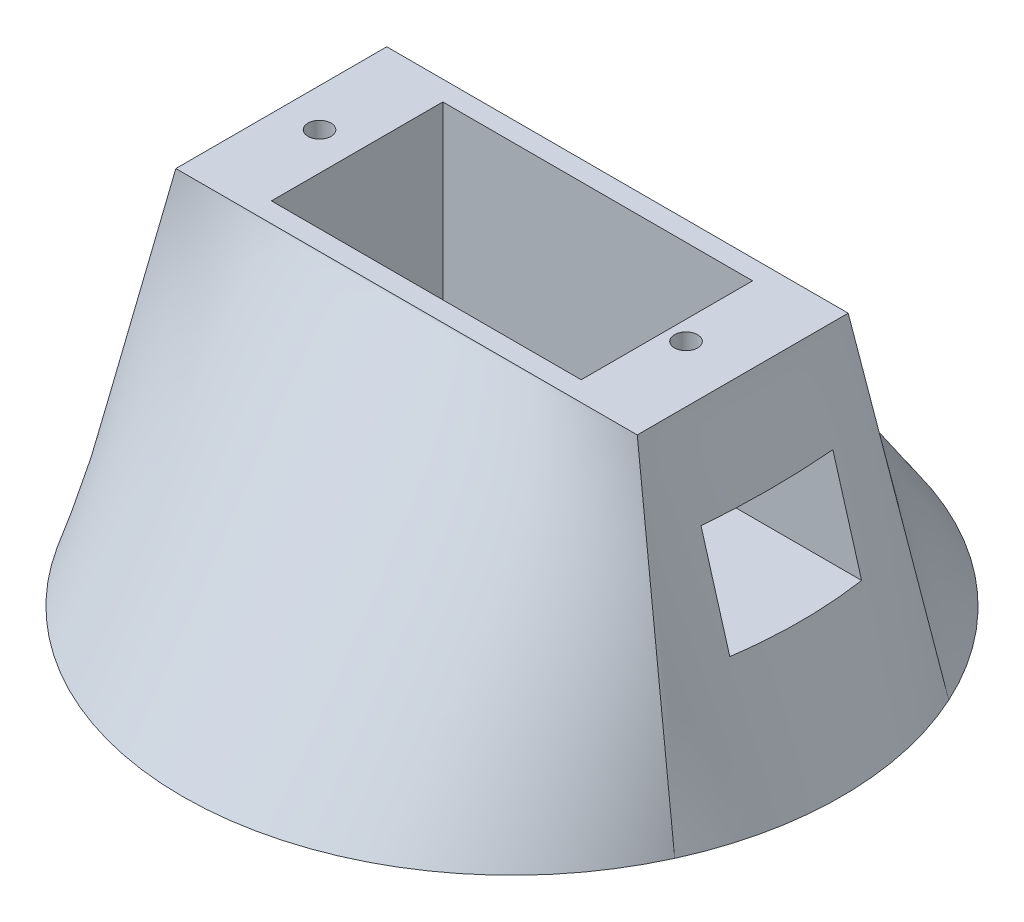
ISO-10303-21;
HEADER;
FILE_DESCRIPTION(('STEP AP214'),'2;1');
FILE_NAME('part.step','',(''),(''),'','','');
FILE_SCHEMA(('AUTOMOTIVE_DESIGN { 1 0 10303 214 1 1 1 1 }'));
ENDSEC;
DATA;
#1=APPLICATION_CONTEXT('core data for automotive mechanical design processes');
#2=APPLICATION_PROTOCOL_DEFINITION('international standard','automotive_design',2000,#1);
#3=PRODUCT_CONTEXT('',#1,'mechanical');
#4=PRODUCT('Part','Part','',(#3));
#5=PRODUCT_RELATED_PRODUCT_CATEGORY('part','',(#4));
#6=PRODUCT_DEFINITION_FORMATION('','',#4);
#7=PRODUCT_DEFINITION_CONTEXT('part definition',#1,'design');
#8=PRODUCT_DEFINITION('design','',#6,#7);
#9=PRODUCT_DEFINITION_SHAPE('','',#8);
#10=(LENGTH_UNIT() NAMED_UNIT(*) SI_UNIT(.MILLI.,.METRE.));
#11=(NAMED_UNIT(*) PLANE_ANGLE_UNIT() SI_UNIT($,.RADIAN.));
#12=(NAMED_UNIT(*) SI_UNIT($,.STERADIAN.) SOLID_ANGLE_UNIT());
#13=UNCERTAINTY_MEASURE_WITH_UNIT(LENGTH_MEASURE(1.E-05),#10,'distance_accuracy_value','');
#14=(GEOMETRIC_REPRESENTATION_CONTEXT(3) GLOBAL_UNCERTAINTY_ASSIGNED_CONTEXT((#13)) GLOBAL_UNIT_ASSIGNED_CONTEXT((#10,
#11,#12)) REPRESENTATION_CONTEXT('',''));
#15=CARTESIAN_POINT('',(0.,0.,0.));
#16=DIRECTION('',(0.,0.,1.));
#17=DIRECTION('',(1.,0.,0.));
#18=AXIS2_PLACEMENT_3D('',#15,#16,#17);
#19=CARTESIAN_POINT('',(0.,24.,0.));
#20=DIRECTION('',(0.,-1.,0.));
#21=DIRECTION('',(0.,0.,-1.));
#22=AXIS2_PLACEMENT_3D('',#19,#20,#21);
#23=PLANE('',#22);
#24=CARTESIAN_POINT('',(13.2,24.,0.));
#25=DIRECTION('',(0.,1.,0.));
#26=DIRECTION('',(0.,0.,1.));
#27=AXIS2_PLACEMENT_3D('',#24,#25,#26);
#28=CIRCLE('',#27,0.875);
#29=CARTESIAN_POINT('',(13.2,24.,0.875));
#30=VERTEX_POINT('',#29);
#31=EDGE_CURVE('E479',#30,#30,#28,.T.);
#32=ORIENTED_EDGE('',*,*,#31,.F.);
#33=EDGE_LOOP('',(#32));
#34=FACE_BOUND('',#33,.T.);
#35=CARTESIAN_POINT('',(-14.6,24.,0.));
#36=DIRECTION('',(0.,1.,0.));
#37=DIRECTION('',(0.,0.,1.));
#38=AXIS2_PLACEMENT_3D('',#35,#36,#37);
#39=CIRCLE('',#38,0.875);
#40=CARTESIAN_POINT('',(-14.6,24.,0.875));
#41=VERTEX_POINT('',#40);
#42=EDGE_CURVE('E490',#41,#41,#39,.T.);
#43=ORIENTED_EDGE('',*,*,#42,.F.);
#44=EDGE_LOOP('',(#43));
#45=FACE_BOUND('',#44,.T.);
#46=CARTESIAN_POINT('',(17.5,24.,-8.));
#47=CARTESIAN_POINT('',(17.5,24.,-6.66666666666667));
#48=CARTESIAN_POINT('',(17.5,24.,-5.33333333333334));
#49=CARTESIAN_POINT('',(17.5,24.,-2.66666666666667));
#50=CARTESIAN_POINT('',(17.5,24.,-1.33333333333334));
#51=CARTESIAN_POINT('',(17.5,24.,1.33333333333333));
#52=CARTESIAN_POINT('',(17.5,24.,2.66666666666666));
#53=CARTESIAN_POINT('',(17.5,24.,5.33333333333333));
#54=CARTESIAN_POINT('',(17.5,24.,6.66666666666667));
#55=CARTESIAN_POINT('',(17.5,24.,8.));
#56=B_SPLINE_CURVE_WITH_KNOTS('',3,(#46,#47,#48,#49,#50,#51,#52,#53,#54,#55),.UNSPECIFIED.,.F.,
.F.,(4,2,2,2,4),(0.,0.25,0.5,0.75,1.),.UNSPECIFIED.);
#57=CARTESIAN_POINT('',(17.5,24.,8.));
#58=VERTEX_POINT('',#57);
#59=CARTESIAN_POINT('',(17.5,24.,-8.));
#60=VERTEX_POINT('',#59);
#61=EDGE_CURVE('E345',#58,#60,#56,.F.);
#62=ORIENTED_EDGE('',*,*,#61,.T.);
#63=CARTESIAN_POINT('',(-17.5,24.,-8.));
#64=CARTESIAN_POINT('',(-16.7708333333333,24.,-8.));
#65=CARTESIAN_POINT('',(-16.0416666666667,24.,-8.));
#66=CARTESIAN_POINT('',(-14.5833333333333,24.,-8.));
#67=CARTESIAN_POINT('',(-13.8541666666667,24.,-8.));
#68=CARTESIAN_POINT('',(-12.3958333333333,24.,-8.));
#69=CARTESIAN_POINT('',(-11.6666666666667,24.,-8.));
#70=CARTESIAN_POINT('',(-10.2083333333333,24.,-8.));
#71=CARTESIAN_POINT('',(-9.47916666666667,24.,-8.));
#72=CARTESIAN_POINT('',(-8.02083333333333,24.,-8.));
#73=CARTESIAN_POINT('',(-7.29166666666667,24.,-8.));
#74=CARTESIAN_POINT('',(-5.83333333333333,24.,-8.));
#75=CARTESIAN_POINT('',(-5.10416666666667,24.,-8.));
#76=CARTESIAN_POINT('',(-3.64583333333333,24.,-8.));
#77=CARTESIAN_POINT('',(-2.91666666666666,24.,-8.));
#78=CARTESIAN_POINT('',(-1.45833333333333,24.,-8.));
#79=CARTESIAN_POINT('',(-0.729166666666663,24.,-8.));
#80=CARTESIAN_POINT('',(0.72916666666667,24.,-8.));
#81=CARTESIAN_POINT('',(1.45833333333334,24.,-8.));
#82=CARTESIAN_POINT('',(2.91666666666667,24.,-8.));
#83=CARTESIAN_POINT('',(3.64583333333334,24.,-8.));
#84=CARTESIAN_POINT('',(5.10416666666667,24.,-8.));
#85=CARTESIAN_POINT('',(5.83333333333334,24.,-8.));
#86=CARTESIAN_POINT('',(7.29166666666667,24.,-8.));
#87=CARTESIAN_POINT('',(8.02083333333333,24.,-8.));
#88=CARTESIAN_POINT('',(9.47916666666667,24.,-8.));
#89=CARTESIAN_POINT('',(10.2083333333333,24.,-8.));
#90=CARTESIAN_POINT('',(11.6666666666667,24.,-8.));
#91=CARTESIAN_POINT('',(12.3958333333333,24.,-8.));
#92=CARTESIAN_POINT('',(13.8541666666667,24.,-8.));
#93=CARTESIAN_POINT('',(14.5833333333333,24.,-8.));
#94=CARTESIAN_POINT('',(16.0416666666667,24.,-8.));
#95=CARTESIAN_POINT('',(16.7708333333333,24.,-8.));
#96=CARTESIAN_POINT('',(17.5,24.,-8.));
#97=B_SPLINE_CURVE_WITH_KNOTS('',3,(#63,#64,#65,#66,#67,#68,#69,#70,#71,#72,#73,#74,#75,#76,#77,
#78,#79,#80,#81,#82,#83,#84,#85,#86,#87,#88,#89,#90,#91,#92,#93,#94,#95,#96),.UNSPECIFIED.,.F.,
.F.,(4,2,2,2,2,2,2,2,2,2,2,2,2,2,2,2,4),(0.,0.0625,0.125,0.1875,0.25,0.3125,0.375,0.4375,0.5,
0.5625,0.625,0.6875,0.75,0.8125,0.875,0.9375,1.),.UNSPECIFIED.);
#98=CARTESIAN_POINT('',(-17.5,24.,-8.));
#99=VERTEX_POINT('',#98);
#100=EDGE_CURVE('E281',#60,#99,#97,.F.);
#101=ORIENTED_EDGE('',*,*,#100,.T.);
#102=CARTESIAN_POINT('',(-17.5,24.,8.));
#103=CARTESIAN_POINT('',(-17.5,24.,6.66666666666667));
#104=CARTESIAN_POINT('',(-17.5,24.,5.33333333333334));
#105=CARTESIAN_POINT('',(-17.5,24.,2.66666666666667));
#106=CARTESIAN_POINT('',(-17.5,24.,1.33333333333334));
#107=CARTESIAN_POINT('',(-17.5,24.,-1.33333333333333));
#108=CARTESIAN_POINT('',(-17.5,24.,-2.66666666666667));
#109=CARTESIAN_POINT('',(-17.5,24.,-5.33333333333333));
#110=CARTESIAN_POINT('',(-17.5,24.,-6.66666666666667));
#111=CARTESIAN_POINT('',(-17.5,24.,-8.));
#112=B_SPLINE_CURVE_WITH_KNOTS('',3,(#102,#103,#104,#105,#106,#107,#108,#109,#110,#111),
.UNSPECIFIED.,.F.,.F.,(4,2,2,2,4),(0.,0.25,0.5,0.75,1.),.UNSPECIFIED.);
#113=CARTESIAN_POINT('',(-17.5,24.,8.));
#114=VERTEX_POINT('',#113);
#115=EDGE_CURVE('E76',#99,#114,#112,.F.);
#116=ORIENTED_EDGE('',*,*,#115,.T.);
#117=CARTESIAN_POINT('',(17.5,24.,8.));
#118=CARTESIAN_POINT('',(16.7708333333333,24.,8.));
#119=CARTESIAN_POINT('',(16.0416666666667,24.,8.));
#120=CARTESIAN_POINT('',(14.5833333333333,24.,8.));
#121=CARTESIAN_POINT('',(13.8541666666666,24.,8.));
#122=CARTESIAN_POINT('',(12.3958333333333,24.,8.));
#123=CARTESIAN_POINT('',(11.6666666666666,24.,8.));
#124=CARTESIAN_POINT('',(10.2083333333333,24.,8.));
#125=CARTESIAN_POINT('',(9.47916666666661,24.,8.));
#126=CARTESIAN_POINT('',(8.02083333333327,24.,8.));
#127=CARTESIAN_POINT('',(7.2916666666666,24.,8.));
#128=CARTESIAN_POINT('',(5.83333333333326,24.,8.));
#129=CARTESIAN_POINT('',(5.10416666666659,24.,8.));
#130=CARTESIAN_POINT('',(3.64583333333326,24.,8.));
#131=CARTESIAN_POINT('',(2.91666666666659,24.,8.));
#132=CARTESIAN_POINT('',(1.45833333333326,24.,8.));
#133=CARTESIAN_POINT('',(0.729166666666591,24.,8.));
#134=CARTESIAN_POINT('',(-0.729166666666744,24.,8.));
#135=CARTESIAN_POINT('',(-1.45833333333341,24.,8.));
#136=CARTESIAN_POINT('',(-2.91666666666675,24.,8.));
#137=CARTESIAN_POINT('',(-3.64583333333341,24.,8.));
#138=CARTESIAN_POINT('',(-5.10416666666674,24.,8.));
#139=CARTESIAN_POINT('',(-5.83333333333341,24.,8.));
#140=CARTESIAN_POINT('',(-7.29166666666674,24.,8.));
#141=CARTESIAN_POINT('',(-8.0208333333334,24.,8.));
#142=CARTESIAN_POINT('',(-9.47916666666673,24.,8.));
#143=CARTESIAN_POINT('',(-10.2083333333334,24.,8.));
#144=CARTESIAN_POINT('',(-11.6666666666667,24.,8.));
#145=CARTESIAN_POINT('',(-12.3958333333334,24.,8.));
#146=CARTESIAN_POINT('',(-13.8541666666667,24.,8.));
#147=CARTESIAN_POINT('',(-14.5833333333334,24.,8.));
#148=CARTESIAN_POINT('',(-16.0416666666667,24.,8.));
#149=CARTESIAN_POINT('',(-16.7708333333333,24.,8.));
#150=CARTESIAN_POINT('',(-17.5,24.,8.));
#151=B_SPLINE_CURVE_WITH_KNOTS('',3,(#117,#118,#119,#120,#121,#122,#123,#124,#125,#126,#127,
#128,#129,#130,#131,#132,#133,#134,#135,#136,#137,#138,#139,#140,#141,#142,#143,#144,#145,#146,
#147,#148,#149,#150),.UNSPECIFIED.,.F.,.F.,(4,2,2,2,2,2,2,2,2,2,2,2,2,2,2,2,4),(0.,
0.0625000000000001,0.125,0.1875,0.25,0.3125,0.375,0.4375,0.5,0.5625,0.625,0.6875,0.75,0.8125,
0.875,0.9375,1.),.UNSPECIFIED.);
#152=EDGE_CURVE('E12',#114,#58,#151,.F.);
#153=ORIENTED_EDGE('',*,*,#152,.T.);
#154=EDGE_LOOP('',(#62,#101,#116,#153));
#155=FACE_BOUND('',#154,.T.);
#156=DIRECTION('',(0.,0.,1.));
#157=VECTOR('',#156,1.);
#158=CARTESIAN_POINT('',(11.75,24.,-6.5));
#159=LINE('',#158,#157);
#160=CARTESIAN_POINT('',(11.75,24.,-6.5));
#161=VERTEX_POINT('',#160);
#162=CARTESIAN_POINT('',(11.75,24.,6.5));
#163=VERTEX_POINT('',#162);
#164=EDGE_CURVE('E476',#161,#163,#159,.T.);
#165=ORIENTED_EDGE('',*,*,#164,.T.);
#166=DIRECTION('',(-1.,0.,0.));
#167=VECTOR('',#166,1.);
#168=CARTESIAN_POINT('',(-11.75,24.,6.5));
#169=LINE('',#168,#167);
#170=CARTESIAN_POINT('',(-11.75,24.,6.5));
#171=VERTEX_POINT('',#170);
#172=EDGE_CURVE('E473',#163,#171,#169,.T.);
#173=ORIENTED_EDGE('',*,*,#172,.T.);
#174=DIRECTION('',(0.,0.,-1.));
#175=VECTOR('',#174,1.);
#176=CARTESIAN_POINT('',(-11.75,24.,-6.5));
#177=LINE('',#176,#175);
#178=CARTESIAN_POINT('',(-11.75,24.,-6.5));
#179=VERTEX_POINT('',#178);
#180=EDGE_CURVE('E470',#171,#179,#177,.T.);
#181=ORIENTED_EDGE('',*,*,#180,.T.);
#182=DIRECTION('',(1.,0.,0.));
#183=VECTOR('',#182,1.);
#184=CARTESIAN_POINT('',(-11.75,24.,-6.5));
#185=LINE('',#184,#183);
#186=EDGE_CURVE('E466',#179,#161,#185,.T.);
#187=ORIENTED_EDGE('',*,*,#186,.T.);
#188=EDGE_LOOP('',(#165,#173,#181,#187));
#189=FACE_BOUND('',#188,.T.);
#190=ADVANCED_FACE('F66',(#34,#45,#155,#189),#23,.F.);
#191=CARTESIAN_POINT('',(0.,0.,0.));
#192=DIRECTION('',(0.,-1.,0.));
#193=DIRECTION('',(0.,0.,-1.));
#194=AXIS2_PLACEMENT_3D('',#191,#192,#193);
#195=PLANE('',#194);
#196=CARTESIAN_POINT('',(0.,0.,0.));
#197=DIRECTION('',(0.,-1.,0.));
#198=DIRECTION('',(0.,0.,-1.));
#199=AXIS2_PLACEMENT_3D('',#196,#197,#198);
#200=CIRCLE('',#199,25.);
#201=CARTESIAN_POINT('',(22.736861889645,0.,10.3939940066949));
#202=VERTEX_POINT('',#201);
#203=CARTESIAN_POINT('',(-22.736861889645,0.,10.3939940066949));
#204=VERTEX_POINT('',#203);
#205=EDGE_CURVE('E293',#202,#204,#200,.T.);
#206=ORIENTED_EDGE('',*,*,#205,.T.);
#207=CARTESIAN_POINT('',(-22.736861889645,0.,-10.3939940066949));
#208=VERTEX_POINT('',#207);
#209=EDGE_CURVE('E304',#204,#208,#200,.T.);
#210=ORIENTED_EDGE('',*,*,#209,.T.);
#211=CARTESIAN_POINT('',(22.736861889645,0.,-10.3939940066949));
#212=VERTEX_POINT('',#211);
#213=EDGE_CURVE('E315',#208,#212,#200,.T.);
#214=ORIENTED_EDGE('',*,*,#213,.T.);
#215=EDGE_CURVE('E325',#212,#202,#200,.T.);
#216=ORIENTED_EDGE('',*,*,#215,.T.);
#217=EDGE_LOOP('',(#206,#210,#214,#216));
#218=FACE_BOUND('',#217,.T.);
#219=ADVANCED_FACE('F68',(#218),#195,.T.);
#220=CARTESIAN_POINT('',(-17.5,24.,8.));
#221=CARTESIAN_POINT('',(-22.736861889645,0.,10.3939940066949));
#222=CARTESIAN_POINT('',(-17.5,24.,6.66666666666667));
#223=CARTESIAN_POINT('',(-23.4570959657197,0.,8.81848196528141));
#224=CARTESIAN_POINT('',(-17.5,24.,5.33333333333334));
#225=CARTESIAN_POINT('',(-24.0284630994066,0.,7.13081695349083));
#226=CARTESIAN_POINT('',(-17.5,24.,2.66666666666667));
#227=CARTESIAN_POINT('',(-24.8002045419033,0.,3.62842169868624));
#228=CARTESIAN_POINT('',(-17.5,24.,1.33333333333334));
#229=CARTESIAN_POINT('',(-25.,0.,1.81445979676444));
#230=CARTESIAN_POINT('',(-17.5,24.,-1.33333333333333));
#231=CARTESIAN_POINT('',(-25.,0.,-1.81445979676443));
#232=CARTESIAN_POINT('',(-17.5,24.,-2.66666666666667));
#233=CARTESIAN_POINT('',(-24.8002045419033,0.,-3.62842169868623));
#234=CARTESIAN_POINT('',(-17.5,24.,-5.33333333333333));
#235=CARTESIAN_POINT('',(-24.0284630994066,0.,-7.13081695349082));
#236=CARTESIAN_POINT('',(-17.5,24.,-6.66666666666667));
#237=CARTESIAN_POINT('',(-23.4570959657197,0.,-8.8184819652814));
#238=CARTESIAN_POINT('',(-17.5,24.,-8.));
#239=CARTESIAN_POINT('',(-22.736861889645,0.,-10.3939940066949));
#240=B_SPLINE_SURFACE_WITH_KNOTS('',3,1,((#220,#221),(#222,#223),(#224,#225),(#226,#227),(#228,
#229),(#230,#231),(#232,#233),(#234,#235),(#236,#237),(#238,#239)),.UNSPECIFIED.,.F.,.F.,.F.,(4,
2,2,2,4),(2,2),(0.,0.25,0.5,0.75,1.),(0.,1.),.UNSPECIFIED.);
#241=DIRECTION('',(-0.212181190810597,-0.972404597784712,-0.09699711579913));
#242=VECTOR('',#241,1.);
#243=CARTESIAN_POINT('',(-20.1184309448225,12.,-9.19699700334743));
#244=LINE('',#243,#242);
#245=EDGE_CURVE('E354',#99,#208,#244,.T.);
#246=DIRECTION('',(0.212181190810597,0.972404597784712,-0.0969971157991304));
#247=VECTOR('',#246,1.);
#248=CARTESIAN_POINT('',(-20.1184309448225,12.,9.19699700334743));
#249=LINE('',#248,#247);
#250=EDGE_CURVE('E356',#204,#114,#249,.T.);
#251=ORIENTED_EDGE('',*,*,#115,.F.);
#252=ORIENTED_EDGE('',*,*,#245,.T.);
#253=ORIENTED_EDGE('',*,*,#209,.F.);
#254=ORIENTED_EDGE('',*,*,#250,.T.);
#255=EDGE_LOOP('',(#251,#252,#253,#254));
#256=FACE_BOUND('',#255,.T.);
#257=ADVANCED_FACE('F244',(#256),#240,.T.);
#258=CARTESIAN_POINT('',(-17.5,24.,-8.));
#259=CARTESIAN_POINT('',(-22.736861889645,0.,-10.3939940066949));
#260=CARTESIAN_POINT('',(-16.7708333333333,24.,-8.));
#261=CARTESIAN_POINT('',(-22.3429838792916,0.,-11.2556021543428));
#262=CARTESIAN_POINT('',(-16.0416666666667,24.,-8.));
#263=CARTESIAN_POINT('',(-21.8856243469112,0.,-12.1265713768389));
#264=CARTESIAN_POINT('',(-14.5833333333333,24.,-8.));
#265=CARTESIAN_POINT('',(-20.828322206986,0.,-13.8641725484667));
#266=CARTESIAN_POINT('',(-13.8541666666667,24.,-8.));
#267=CARTESIAN_POINT('',(-20.2282827215911,0.,-14.7307969787131));
#268=CARTESIAN_POINT('',(-12.3958333333333,24.,-8.));
#269=CARTESIAN_POINT('',(-18.874437574064,0.,-16.4297111281801));
#270=CARTESIAN_POINT('',(-11.6666666666667,24.,-8.));
#271=CARTESIAN_POINT('',(-18.1205257724933,0.,-17.2619488036563));
#272=CARTESIAN_POINT('',(-10.2083333333333,24.,-8.));
#273=CARTESIAN_POINT('',(-16.4554441268778,0.,-18.8559457296326));
#274=CARTESIAN_POINT('',(-9.47916666666667,24.,-8.));
#275=CARTESIAN_POINT('',(-15.5441821170962,0.,-19.6175982550032));
#276=CARTESIAN_POINT('',(-8.02083333333333,24.,-8.));
#277=CARTESIAN_POINT('',(-13.5716756733641,0.,-21.0304868797937));
#278=CARTESIAN_POINT('',(-7.29166666666667,24.,-8.));
#279=CARTESIAN_POINT('',(-12.51038472891,0.,-21.6815654868221));
#280=CARTESIAN_POINT('',(-5.83333333333333,24.,-8.));
#281=CARTESIAN_POINT('',(-10.2580715209512,0.,-22.8335712646039));
#282=CARTESIAN_POINT('',(-5.10416666666667,24.,-8.));
#283=CARTESIAN_POINT('',(-9.06707849856131,0.,-23.3343148560265));
#284=CARTESIAN_POINT('',(-3.64583333333333,24.,-8.));
#285=CARTESIAN_POINT('',(-6.58895455876039,0.,-24.1513527596663));
#286=CARTESIAN_POINT('',(-2.91666666666666,24.,-8.));
#287=CARTESIAN_POINT('',(-5.30194191205758,0.,-24.4674811523066));
#288=CARTESIAN_POINT('',(-1.45833333333333,24.,-8.));
#289=CARTESIAN_POINT('',(-2.67652856687136,0.,-24.8918544268608));
#290=CARTESIAN_POINT('',(-0.729166666666663,24.,-8.));
#291=CARTESIAN_POINT('',(-1.33831921486832,0.,-25.));
#292=CARTESIAN_POINT('',(0.72916666666667,24.,-8.));
#293=CARTESIAN_POINT('',(1.33831921486831,0.,-25.));
#294=CARTESIAN_POINT('',(1.45833333333334,24.,-8.));
#295=CARTESIAN_POINT('',(2.67652856687135,0.,-24.8918544268608));
#296=CARTESIAN_POINT('',(2.91666666666667,24.,-8.));
#297=CARTESIAN_POINT('',(5.30194191205758,0.,-24.4674811523066));
#298=CARTESIAN_POINT('',(3.64583333333334,24.,-8.));
#299=CARTESIAN_POINT('',(6.58895455876039,0.,-24.1513527596663));
#300=CARTESIAN_POINT('',(5.10416666666667,24.,-8.));
#301=CARTESIAN_POINT('',(9.0670784985613,0.,-23.3343148560265));
#302=CARTESIAN_POINT('',(5.83333333333334,24.,-8.));
#303=CARTESIAN_POINT('',(10.2580715209512,0.,-22.8335712646039));
#304=CARTESIAN_POINT('',(7.29166666666667,24.,-8.));
#305=CARTESIAN_POINT('',(12.51038472891,0.,-21.6815654868221));
#306=CARTESIAN_POINT('',(8.02083333333334,24.,-8.));
#307=CARTESIAN_POINT('',(13.5716756733641,0.,-21.0304868797937));
#308=CARTESIAN_POINT('',(9.47916666666667,24.,-8.));
#309=CARTESIAN_POINT('',(15.5441821170962,0.,-19.6175982550032));
#310=CARTESIAN_POINT('',(10.2083333333333,24.,-8.));
#311=CARTESIAN_POINT('',(16.4554441268778,0.,-18.8559457296326));
#312=CARTESIAN_POINT('',(11.6666666666667,24.,-8.));
#313=CARTESIAN_POINT('',(18.1205257724933,0.,-17.2619488036563));
#314=CARTESIAN_POINT('',(12.3958333333333,24.,-8.));
#315=CARTESIAN_POINT('',(18.874437574064,0.,-16.4297111281801));
#316=CARTESIAN_POINT('',(13.8541666666667,24.,-8.));
#317=CARTESIAN_POINT('',(20.2282827215911,0.,-14.7307969787132));
#318=CARTESIAN_POINT('',(14.5833333333333,24.,-8.));
#319=CARTESIAN_POINT('',(20.828322206986,0.,-13.8641725484667));
#320=CARTESIAN_POINT('',(16.0416666666667,24.,-8.));
#321=CARTESIAN_POINT('',(21.8856243469112,0.,-12.1265713768389));
#322=CARTESIAN_POINT('',(16.7708333333333,24.,-8.));
#323=CARTESIAN_POINT('',(22.3429838792916,0.,-11.2556021543429));
#324=CARTESIAN_POINT('',(17.5,24.,-8.));
#325=CARTESIAN_POINT('',(22.736861889645,0.,-10.3939940066949));
#326=B_SPLINE_SURFACE_WITH_KNOTS('',3,1,((#258,#259),(#260,#261),(#262,#263),(#264,#265),(#266,
#267),(#268,#269),(#270,#271),(#272,#273),(#274,#275),(#276,#277),(#278,#279),(#280,#281),(#282,
#283),(#284,#285),(#286,#287),(#288,#289),(#290,#291),(#292,#293),(#294,#295),(#296,#297),(#298,
#299),(#300,#301),(#302,#303),(#304,#305),(#306,#307),(#308,#309),(#310,#311),(#312,#313),(#314,
#315),(#316,#317),(#318,#319),(#320,#321),(#322,#323),(#324,#325)),.UNSPECIFIED.,.F.,.F.,.F.,(4,
2,2,2,2,2,2,2,2,2,2,2,2,2,2,2,4),(2,2),(0.,0.0625,0.125,0.1875,0.25,0.3125,0.375,0.4375,0.5,
0.5625,0.625,0.6875,0.75,0.8125,0.875,0.9375,1.),(0.,1.),.UNSPECIFIED.);
#327=DIRECTION('',(0.212181190810597,-0.972404597784712,-0.0969971157991303));
#328=VECTOR('',#327,1.);
#329=CARTESIAN_POINT('',(20.1184309448225,12.,-9.19699700334743));
#330=LINE('',#329,#328);
#331=EDGE_CURVE('E338',#60,#212,#330,.T.);
#332=ORIENTED_EDGE('',*,*,#100,.F.);
#333=ORIENTED_EDGE('',*,*,#331,.T.);
#334=ORIENTED_EDGE('',*,*,#213,.F.);
#335=ORIENTED_EDGE('',*,*,#245,.F.);
#336=EDGE_LOOP('',(#332,#333,#334,#335));
#337=FACE_BOUND('',#336,.T.);
#338=ADVANCED_FACE('F360',(#337),#326,.T.);
#339=CARTESIAN_POINT('',(17.5,24.,8.));
#340=CARTESIAN_POINT('',(22.736861889645,0.,10.3939940066949));
#341=CARTESIAN_POINT('',(16.7708333333333,24.,8.));
#342=CARTESIAN_POINT('',(22.3429838792916,0.,11.2556021543428));
#343=CARTESIAN_POINT('',(16.0416666666667,24.,8.));
#344=CARTESIAN_POINT('',(21.8856243469112,0.,12.1265713768389));
#345=CARTESIAN_POINT('',(14.5833333333333,24.,8.));
#346=CARTESIAN_POINT('',(20.828322206986,0.,13.8641725484667));
#347=CARTESIAN_POINT('',(13.8541666666666,24.,8.));
#348=CARTESIAN_POINT('',(20.2282827215911,0.,14.7307969787131));
#349=CARTESIAN_POINT('',(12.3958333333333,24.,8.));
#350=CARTESIAN_POINT('',(18.874437574064,0.,16.4297111281801));
#351=CARTESIAN_POINT('',(11.6666666666666,24.,8.));
#352=CARTESIAN_POINT('',(18.1205257724933,0.,17.2619488036563));
#353=CARTESIAN_POINT('',(10.2083333333333,24.,8.));
#354=CARTESIAN_POINT('',(16.4554441268778,0.,18.8559457296326));
#355=CARTESIAN_POINT('',(9.47916666666661,24.,8.));
#356=CARTESIAN_POINT('',(15.5441821170962,0.,19.6175982550032));
#357=CARTESIAN_POINT('',(8.02083333333327,24.,8.));
#358=CARTESIAN_POINT('',(13.5716756733641,0.,21.0304868797937));
#359=CARTESIAN_POINT('',(7.2916666666666,24.,8.));
#360=CARTESIAN_POINT('',(12.51038472891,0.,21.6815654868221));
#361=CARTESIAN_POINT('',(5.83333333333326,24.,8.));
#362=CARTESIAN_POINT('',(10.2580715209512,0.,22.8335712646039));
#363=CARTESIAN_POINT('',(5.10416666666659,24.,8.));
#364=CARTESIAN_POINT('',(9.06707849856132,0.,23.3343148560265));
#365=CARTESIAN_POINT('',(3.64583333333326,24.,8.));
#366=CARTESIAN_POINT('',(6.5889545587604,0.,24.1513527596663));
#367=CARTESIAN_POINT('',(2.91666666666659,24.,8.));
#368=CARTESIAN_POINT('',(5.30194191205758,0.,24.4674811523066));
#369=CARTESIAN_POINT('',(1.45833333333326,24.,8.));
#370=CARTESIAN_POINT('',(2.67652856687136,0.,24.8918544268608));
#371=CARTESIAN_POINT('',(0.729166666666591,24.,8.));
#372=CARTESIAN_POINT('',(1.33831921486832,0.,25.));
#373=CARTESIAN_POINT('',(-0.729166666666744,24.,8.));
#374=CARTESIAN_POINT('',(-1.33831921486832,0.,25.));
#375=CARTESIAN_POINT('',(-1.45833333333341,24.,8.));
#376=CARTESIAN_POINT('',(-2.67652856687135,0.,24.8918544268608));
#377=CARTESIAN_POINT('',(-2.91666666666675,24.,8.));
#378=CARTESIAN_POINT('',(-5.30194191205757,0.,24.4674811523066));
#379=CARTESIAN_POINT('',(-3.64583333333341,24.,8.));
#380=CARTESIAN_POINT('',(-6.58895455876039,0.,24.1513527596663));
#381=CARTESIAN_POINT('',(-5.10416666666674,24.,8.));
#382=CARTESIAN_POINT('',(-9.06707849856131,0.,23.3343148560264));
#383=CARTESIAN_POINT('',(-5.83333333333341,24.,8.));
#384=CARTESIAN_POINT('',(-10.2580715209512,0.,22.8335712646039));
#385=CARTESIAN_POINT('',(-7.29166666666674,24.,8.));
#386=CARTESIAN_POINT('',(-12.51038472891,0.,21.6815654868221));
#387=CARTESIAN_POINT('',(-8.0208333333334,24.,8.));
#388=CARTESIAN_POINT('',(-13.5716756733641,0.,21.0304868797937));
#389=CARTESIAN_POINT('',(-9.47916666666673,24.,8.));
#390=CARTESIAN_POINT('',(-15.5441821170962,0.,19.6175982550032));
#391=CARTESIAN_POINT('',(-10.2083333333334,24.,8.));
#392=CARTESIAN_POINT('',(-16.4554441268778,0.,18.8559457296326));
#393=CARTESIAN_POINT('',(-11.6666666666667,24.,8.));
#394=CARTESIAN_POINT('',(-18.1205257724933,0.,17.2619488036563));
#395=CARTESIAN_POINT('',(-12.3958333333334,24.,8.));
#396=CARTESIAN_POINT('',(-18.874437574064,0.,16.4297111281801));
#397=CARTESIAN_POINT('',(-13.8541666666667,24.,8.));
#398=CARTESIAN_POINT('',(-20.2282827215911,0.,14.7307969787132));
#399=CARTESIAN_POINT('',(-14.5833333333334,24.,8.));
#400=CARTESIAN_POINT('',(-20.828322206986,0.,13.8641725484667));
#401=CARTESIAN_POINT('',(-16.0416666666667,24.,8.));
#402=CARTESIAN_POINT('',(-21.8856243469112,0.,12.1265713768389));
#403=CARTESIAN_POINT('',(-16.7708333333333,24.,8.));
#404=CARTESIAN_POINT('',(-22.3429838792916,0.,11.2556021543428));
#405=CARTESIAN_POINT('',(-17.5,24.,8.));
#406=CARTESIAN_POINT('',(-22.736861889645,0.,10.3939940066949));
#407=B_SPLINE_SURFACE_WITH_KNOTS('',3,1,((#339,#340),(#341,#342),(#343,#344),(#345,#346),(#347,
#348),(#349,#350),(#351,#352),(#353,#354),(#355,#356),(#357,#358),(#359,#360),(#361,#362),(#363,
#364),(#365,#366),(#367,#368),(#369,#370),(#371,#372),(#373,#374),(#375,#376),(#377,#378),(#379,
#380),(#381,#382),(#383,#384),(#385,#386),(#387,#388),(#389,#390),(#391,#392),(#393,#394),(#395,
#396),(#397,#398),(#399,#400),(#401,#402),(#403,#404),(#405,#406)),.UNSPECIFIED.,.F.,.F.,.F.,(4,
2,2,2,2,2,2,2,2,2,2,2,2,2,2,2,4),(2,2),(0.,0.0625000000000001,0.125,0.1875,0.25,0.3125,0.375,
0.4375,0.5,0.5625,0.625,0.6875,0.75,0.8125,0.875,0.9375,1.),(0.,1.),.UNSPECIFIED.);
#408=DIRECTION('',(0.212181190810598,-0.972404597784712,0.0969971157991302));
#409=VECTOR('',#408,1.);
#410=CARTESIAN_POINT('',(20.1184309448225,12.,9.19699700334743));
#411=LINE('',#410,#409);
#412=EDGE_CURVE('E335',#58,#202,#411,.T.);
#413=ORIENTED_EDGE('',*,*,#152,.F.);
#414=ORIENTED_EDGE('',*,*,#250,.F.);
#415=ORIENTED_EDGE('',*,*,#205,.F.);
#416=ORIENTED_EDGE('',*,*,#412,.F.);
#417=EDGE_LOOP('',(#413,#414,#415,#416));
#418=FACE_BOUND('',#417,.T.);
#419=ADVANCED_FACE('F386',(#418),#407,.T.);
#420=CARTESIAN_POINT('',(17.5,24.,-8.));
#421=CARTESIAN_POINT('',(22.736861889645,0.,-10.3939940066949));
#422=CARTESIAN_POINT('',(17.5,24.,-6.66666666666667));
#423=CARTESIAN_POINT('',(23.4570959657197,0.,-8.8184819652814));
#424=CARTESIAN_POINT('',(17.5,24.,-5.33333333333334));
#425=CARTESIAN_POINT('',(24.0284630994066,0.,-7.13081695349083));
#426=CARTESIAN_POINT('',(17.5,24.,-2.66666666666667));
#427=CARTESIAN_POINT('',(24.8002045419033,0.,-3.62842169868624));
#428=CARTESIAN_POINT('',(17.5,24.,-1.33333333333334));
#429=CARTESIAN_POINT('',(25.,0.,-1.81445979676444));
#430=CARTESIAN_POINT('',(17.5,24.,1.33333333333333));
#431=CARTESIAN_POINT('',(25.,0.,1.81445979676443));
#432=CARTESIAN_POINT('',(17.5,24.,2.66666666666666));
#433=CARTESIAN_POINT('',(24.8002045419033,0.,3.62842169868623));
#434=CARTESIAN_POINT('',(17.5,24.,5.33333333333333));
#435=CARTESIAN_POINT('',(24.0284630994066,0.,7.13081695349082));
#436=CARTESIAN_POINT('',(17.5,24.,6.66666666666667));
#437=CARTESIAN_POINT('',(23.4570959657197,0.,8.8184819652814));
#438=CARTESIAN_POINT('',(17.5,24.,8.));
#439=CARTESIAN_POINT('',(22.736861889645,0.,10.3939940066949));
#440=B_SPLINE_SURFACE_WITH_KNOTS('',3,1,((#420,#421),(#422,#423),(#424,#425),(#426,#427),(#428,
#429),(#430,#431),(#432,#433),(#434,#435),(#436,#437),(#438,#439)),.UNSPECIFIED.,.F.,.F.,.F.,(4,
2,2,2,4),(2,2),(0.,0.25,0.5,0.75,1.),(0.,1.),.UNSPECIFIED.);
#441=CARTESIAN_POINT('',(19.3384788694201,17.45,5.));
#442=CARTESIAN_POINT('',(19.3729119249743,17.45,4.58535776615454));
#443=CARTESIAN_POINT('',(19.403110560845,17.45,4.17037564711991));
#444=CARTESIAN_POINT('',(19.4550010470512,17.45,3.33987324158382));
#445=CARTESIAN_POINT('',(19.4766927595206,17.45,2.92435294646998));
#446=CARTESIAN_POINT('',(19.5288868878113,17.45,1.67870264155682));
#447=CARTESIAN_POINT('',(19.5466315389489,17.45,0.84800069315386));
#448=CARTESIAN_POINT('',(19.5471150627282,17.45,-0.819168746001097));
#449=CARTESIAN_POINT('',(19.5296106332402,17.45,-1.65563632041462));
#450=CARTESIAN_POINT('',(19.4774145823069,17.45,-2.90993549525904));
#451=CARTESIAN_POINT('',(19.4556614085591,17.45,-3.32834412900135));
#452=CARTESIAN_POINT('',(19.4035292029541,17.45,-4.16461662272331));
#453=CARTESIAN_POINT('',(19.3731503181617,17.45,-4.58248049186895));
#454=CARTESIAN_POINT('',(19.3384788694201,17.45,-5.));
#455=B_SPLINE_CURVE_WITH_KNOTS('',3,(#441,#442,#443,#444,#445,#446,#447,#448,#449,#450,#451,
#452,#453,#454),.UNSPECIFIED.,.F.,.F.,(4,2,2,2,2,2,4),(0.,1.24816301612441,2.49634625956232,
4.98825324074282,7.49741923374137,8.75426390909655,10.0110871570726),.UNSPECIFIED.);
#456=CARTESIAN_POINT('',(19.3384788694201,17.45,5.));
#457=VERTEX_POINT('',#456);
#458=CARTESIAN_POINT('',(19.3384788694201,17.45,-5.));
#459=VERTEX_POINT('',#458);
#460=EDGE_CURVE('E172',#457,#459,#455,.T.);
#461=CARTESIAN_POINT('',(19.3384788694201,17.45,-5.));
#462=CARTESIAN_POINT('',(19.4578244754493,17.0328022276489,-5.));
#463=CARTESIAN_POINT('',(19.5775188422407,16.61570430814,-5.));
#464=CARTESIAN_POINT('',(19.817559481692,15.7816978749914,-5.));
#465=CARTESIAN_POINT('',(19.9379057517666,15.3647893606077,-5.));
#466=CARTESIAN_POINT('',(20.1792053261359,14.5311488314596,-5.));
#467=CARTESIAN_POINT('',(20.300158629411,14.1144168164,-5.));
#468=CARTESIAN_POINT('',(20.542631486482,13.2811177249241,-5.));
#469=CARTESIAN_POINT('',(20.6641510400819,12.8645506484507,-5.));
#470=CARTESIAN_POINT('',(20.9077182956698,12.031570036138,-5.));
#471=CARTESIAN_POINT('',(21.0297659987267,11.6151565006113,-5.));
#472=CARTESIAN_POINT('',(21.2743548561801,10.7824727703406,-5.));
#473=CARTESIAN_POINT('',(21.3968960123164,10.3662025761075,-5.));
#474=CARTESIAN_POINT('',(21.5196662378313,9.95,-5.));
#475=B_SPLINE_CURVE_WITH_KNOTS('',3,(#461,#462,#463,#464,#465,#466,#467,#468,#469,#470,#471,
#472,#473,#474),.UNSPECIFIED.,.F.,.F.,(4,2,2,2,2,2,4),(0.,1.30179702354045,2.6035888882865,
3.90537856701749,5.20716779516714,6.50895965962055,7.81075611800218),.UNSPECIFIED.);
#476=CARTESIAN_POINT('',(21.5196662378313,9.95,-5.));
#477=VERTEX_POINT('',#476);
#478=EDGE_CURVE('E158',#459,#477,#475,.T.);
#479=CARTESIAN_POINT('',(21.5196662378313,9.95,-5.));
#480=CARTESIAN_POINT('',(21.5806357588274,9.95,-4.59080594313091));
#481=CARTESIAN_POINT('',(21.6340958473504,9.95,-4.18049617743075));
#482=CARTESIAN_POINT('',(21.7260111150508,9.95,-3.35815426891955));
#483=CARTESIAN_POINT('',(21.7644646786692,9.95,-2.9461219454864));
#484=CARTESIAN_POINT('',(21.826345585285,9.95,-2.12122750325099));
#485=CARTESIAN_POINT('',(21.8497836602343,9.95,-1.70836618913901));
#486=CARTESIAN_POINT('',(21.8815599504139,9.95,-0.882099138911923));
#487=CARTESIAN_POINT('',(21.8898995778291,9.95,-0.468693457332384));
#488=CARTESIAN_POINT('',(21.8912726279386,9.95,0.366369445972897));
#489=CARTESIAN_POINT('',(21.8839982474819,9.95,0.788027209273361));
#490=CARTESIAN_POINT('',(21.853730198409,9.95,1.63074276411004));
#491=CARTESIAN_POINT('',(21.8307377129156,9.95,2.05180059841347));
#492=CARTESIAN_POINT('',(21.7690028657506,9.95,2.8950886428158));
#493=CARTESIAN_POINT('',(21.7301746011003,9.95,3.31731256974397));
#494=CARTESIAN_POINT('',(21.636750216168,9.95,4.16008181528654));
#495=CARTESIAN_POINT('',(21.5821515175059,9.95,4.58062684800309));
#496=CARTESIAN_POINT('',(21.5196662378313,9.95,5.));
#497=B_SPLINE_CURVE_WITH_KNOTS('',3,(#479,#480,#481,#482,#483,#484,#485,#486,#487,#488,#489,
#490,#491,#492,#493,#494,#495,#496),.UNSPECIFIED.,.F.,.F.,(4,2,2,2,2,2,2,2,4),(0.,
1.24105971770598,2.48225300746597,3.722558192169,4.96274736291259,6.22760893075763,
7.49237530126603,8.7640957797377,10.0360242953879),.UNSPECIFIED.);
#498=CARTESIAN_POINT('',(21.5196662378313,9.95,5.));
#499=VERTEX_POINT('',#498);
#500=EDGE_CURVE('E216',#477,#499,#497,.T.);
#501=CARTESIAN_POINT('',(21.5196662378313,9.95,5.));
#502=CARTESIAN_POINT('',(21.3968960123164,10.3662025761075,5.));
#503=CARTESIAN_POINT('',(21.2743548561801,10.7824727703406,5.));
#504=CARTESIAN_POINT('',(21.0297659987267,11.6151565006113,5.));
#505=CARTESIAN_POINT('',(20.9077182956698,12.031570036138,5.));
#506=CARTESIAN_POINT('',(20.6641510400819,12.8645506484507,5.));
#507=CARTESIAN_POINT('',(20.542631486482,13.2811177249241,5.));
#508=CARTESIAN_POINT('',(20.300158629411,14.1144168164,5.));
#509=CARTESIAN_POINT('',(20.1792053261359,14.5311488314596,5.));
#510=CARTESIAN_POINT('',(19.9379057517666,15.3647893606077,5.));
#511=CARTESIAN_POINT('',(19.817559481692,15.7816978749914,5.));
#512=CARTESIAN_POINT('',(19.5775188422407,16.61570430814,5.));
#513=CARTESIAN_POINT('',(19.4578244754493,17.0328022276489,5.));
#514=CARTESIAN_POINT('',(19.3384788694201,17.45,5.));
#515=B_SPLINE_CURVE_WITH_KNOTS('',3,(#501,#502,#503,#504,#505,#506,#507,#508,#509,#510,#511,
#512,#513,#514),.UNSPECIFIED.,.F.,.F.,(4,2,2,2,2,2,4),(0.,1.30179645838162,2.60358832283504,
3.90537755098469,5.20716722971567,6.50895909446173,7.81075611800218),.UNSPECIFIED.);
#516=EDGE_CURVE('E180',#499,#457,#515,.T.);
#517=ORIENTED_EDGE('',*,*,#460,.T.);
#518=ORIENTED_EDGE('',*,*,#478,.T.);
#519=ORIENTED_EDGE('',*,*,#500,.T.);
#520=ORIENTED_EDGE('',*,*,#516,.T.);
#521=EDGE_LOOP('',(#517,#518,#519,#520));
#522=FACE_BOUND('',#521,.T.);
#523=ORIENTED_EDGE('',*,*,#61,.F.);
#524=ORIENTED_EDGE('',*,*,#412,.T.);
#525=ORIENTED_EDGE('',*,*,#215,.F.);
#526=ORIENTED_EDGE('',*,*,#331,.F.);
#527=EDGE_LOOP('',(#523,#524,#525,#526));
#528=FACE_BOUND('',#527,.T.);
#529=ADVANCED_FACE('F178',(#522,#528),#440,.T.);
#530=CARTESIAN_POINT('',(11.75,8.3,-6.5));
#531=DIRECTION('',(-1.,0.,0.));
#532=DIRECTION('',(0.,0.,1.));
#533=AXIS2_PLACEMENT_3D('',#530,#531,#532);
#534=PLANE('',#533);
#535=DIRECTION('',(0.,0.,-1.));
#536=VECTOR('',#535,1.);
#537=CARTESIAN_POINT('',(11.75,17.45,-5.));
#538=LINE('',#537,#536);
#539=CARTESIAN_POINT('',(11.75,17.45,5.));
#540=VERTEX_POINT('',#539);
#541=CARTESIAN_POINT('',(11.75,17.45,-5.));
#542=VERTEX_POINT('',#541);
#543=EDGE_CURVE('E175',#540,#542,#538,.T.);
#544=ORIENTED_EDGE('',*,*,#543,.F.);
#545=DIRECTION('',(0.,1.,0.));
#546=VECTOR('',#545,1.);
#547=CARTESIAN_POINT('',(11.75,9.95,5.));
#548=LINE('',#547,#546);
#549=CARTESIAN_POINT('',(11.75,9.95,5.));
#550=VERTEX_POINT('',#549);
#551=EDGE_CURVE('E192',#550,#540,#548,.T.);
#552=ORIENTED_EDGE('',*,*,#551,.F.);
#553=DIRECTION('',(0.,0.,1.));
#554=VECTOR('',#553,1.);
#555=CARTESIAN_POINT('',(11.75,9.95,-5.));
#556=LINE('',#555,#554);
#557=CARTESIAN_POINT('',(11.75,9.95,-5.));
#558=VERTEX_POINT('',#557);
#559=EDGE_CURVE('E91',#558,#550,#556,.T.);
#560=ORIENTED_EDGE('',*,*,#559,.F.);
#561=DIRECTION('',(0.,-1.,0.));
#562=VECTOR('',#561,1.);
#563=CARTESIAN_POINT('',(11.75,9.95,-5.));
#564=LINE('',#563,#562);
#565=EDGE_CURVE('E182',#542,#558,#564,.T.);
#566=ORIENTED_EDGE('',*,*,#565,.F.);
#567=EDGE_LOOP('',(#544,#552,#560,#566));
#568=FACE_BOUND('',#567,.T.);
#569=ORIENTED_EDGE('',*,*,#164,.F.);
#570=DIRECTION('',(0.,1.,0.));
#571=VECTOR('',#570,1.);
#572=CARTESIAN_POINT('',(11.75,8.3,-6.5));
#573=LINE('',#572,#571);
#574=CARTESIAN_POINT('',(11.75,8.3,-6.5));
#575=VERTEX_POINT('',#574);
#576=EDGE_CURVE('E462',#575,#161,#573,.T.);
#577=ORIENTED_EDGE('',*,*,#576,.F.);
#578=DIRECTION('',(0.,0.,1.));
#579=VECTOR('',#578,1.);
#580=CARTESIAN_POINT('',(11.75,8.3,-6.5));
#581=LINE('',#580,#579);
#582=CARTESIAN_POINT('',(11.75,8.3,6.5));
#583=VERTEX_POINT('',#582);
#584=EDGE_CURVE('E469',#575,#583,#581,.T.);
#585=ORIENTED_EDGE('',*,*,#584,.T.);
#586=DIRECTION('',(0.,1.,0.));
#587=VECTOR('',#586,1.);
#588=CARTESIAN_POINT('',(11.75,8.3,6.5));
#589=LINE('',#588,#587);
#590=EDGE_CURVE('E365',#583,#163,#589,.T.);
#591=ORIENTED_EDGE('',*,*,#590,.T.);
#592=EDGE_LOOP('',(#569,#577,#585,#591));
#593=FACE_BOUND('',#592,.T.);
#594=ADVANCED_FACE('F497',(#568,#593),#534,.T.);
#595=CARTESIAN_POINT('',(-11.75,8.3,6.5));
#596=DIRECTION('',(0.,0.,-1.));
#597=DIRECTION('',(-1.,0.,0.));
#598=AXIS2_PLACEMENT_3D('',#595,#596,#597);
#599=PLANE('',#598);
#600=ORIENTED_EDGE('',*,*,#172,.F.);
#601=ORIENTED_EDGE('',*,*,#590,.F.);
#602=DIRECTION('',(-1.,0.,0.));
#603=VECTOR('',#602,1.);
#604=CARTESIAN_POINT('',(-11.75,8.3,6.5));
#605=LINE('',#604,#603);
#606=CARTESIAN_POINT('',(-11.75,8.3,6.5));
#607=VERTEX_POINT('',#606);
#608=EDGE_CURVE('E483',#583,#607,#605,.T.);
#609=ORIENTED_EDGE('',*,*,#608,.T.);
#610=DIRECTION('',(0.,1.,0.));
#611=VECTOR('',#610,1.);
#612=CARTESIAN_POINT('',(-11.75,8.3,6.5));
#613=LINE('',#612,#611);
#614=EDGE_CURVE('E458',#607,#171,#613,.T.);
#615=ORIENTED_EDGE('',*,*,#614,.T.);
#616=EDGE_LOOP('',(#600,#601,#609,#615));
#617=FACE_BOUND('',#616,.T.);
#618=ADVANCED_FACE('F501',(#617),#599,.T.);
#619=CARTESIAN_POINT('',(-11.75,8.3,-6.5));
#620=DIRECTION('',(1.,0.,0.));
#621=DIRECTION('',(0.,0.,-1.));
#622=AXIS2_PLACEMENT_3D('',#619,#620,#621);
#623=PLANE('',#622);
#624=ORIENTED_EDGE('',*,*,#180,.F.);
#625=ORIENTED_EDGE('',*,*,#614,.F.);
#626=DIRECTION('',(0.,0.,-1.));
#627=VECTOR('',#626,1.);
#628=CARTESIAN_POINT('',(-11.75,8.3,-6.5));
#629=LINE('',#628,#627);
#630=CARTESIAN_POINT('',(-11.75,8.3,-6.5));
#631=VERTEX_POINT('',#630);
#632=EDGE_CURVE('E481',#607,#631,#629,.T.);
#633=ORIENTED_EDGE('',*,*,#632,.T.);
#634=DIRECTION('',(0.,1.,0.));
#635=VECTOR('',#634,1.);
#636=CARTESIAN_POINT('',(-11.75,8.3,-6.5));
#637=LINE('',#636,#635);
#638=EDGE_CURVE('E460',#631,#179,#637,.T.);
#639=ORIENTED_EDGE('',*,*,#638,.T.);
#640=EDGE_LOOP('',(#624,#625,#633,#639));
#641=FACE_BOUND('',#640,.T.);
#642=ADVANCED_FACE('F513',(#641),#623,.T.);
#643=CARTESIAN_POINT('',(-11.75,8.3,-6.5));
#644=DIRECTION('',(0.,0.,1.));
#645=DIRECTION('',(1.,0.,0.));
#646=AXIS2_PLACEMENT_3D('',#643,#644,#645);
#647=PLANE('',#646);
#648=ORIENTED_EDGE('',*,*,#186,.F.);
#649=ORIENTED_EDGE('',*,*,#638,.F.);
#650=DIRECTION('',(1.,0.,0.));
#651=VECTOR('',#650,1.);
#652=CARTESIAN_POINT('',(-11.75,8.3,-6.5));
#653=LINE('',#652,#651);
#654=EDGE_CURVE('E465',#631,#575,#653,.T.);
#655=ORIENTED_EDGE('',*,*,#654,.T.);
#656=ORIENTED_EDGE('',*,*,#576,.T.);
#657=EDGE_LOOP('',(#648,#649,#655,#656));
#658=FACE_BOUND('',#657,.T.);
#659=ADVANCED_FACE('F507',(#658),#647,.T.);
#660=CARTESIAN_POINT('',(0.,8.3,0.));
#661=DIRECTION('',(0.,1.,0.));
#662=DIRECTION('',(0.,0.,1.));
#663=AXIS2_PLACEMENT_3D('',#660,#661,#662);
#664=PLANE('',#663);
#665=ORIENTED_EDGE('',*,*,#584,.F.);
#666=ORIENTED_EDGE('',*,*,#654,.F.);
#667=ORIENTED_EDGE('',*,*,#632,.F.);
#668=ORIENTED_EDGE('',*,*,#608,.F.);
#669=EDGE_LOOP('',(#665,#666,#667,#668));
#670=FACE_BOUND('',#669,.T.);
#671=ADVANCED_FACE('F516',(#670),#664,.T.);
#672=CARTESIAN_POINT('',(-14.6,16.,0.));
#673=DIRECTION('',(0.,1.,0.));
#674=DIRECTION('',(0.,0.,1.));
#675=AXIS2_PLACEMENT_3D('',#672,#673,#674);
#676=CYLINDRICAL_SURFACE('',#675,0.875);
#677=CARTESIAN_POINT('',(-14.6,16.,0.));
#678=DIRECTION('',(0.,1.,0.));
#679=DIRECTION('',(0.,0.,1.));
#680=AXIS2_PLACEMENT_3D('',#677,#678,#679);
#681=CIRCLE('',#680,0.875);
#682=CARTESIAN_POINT('',(-14.6,16.,0.875));
#683=VERTEX_POINT('',#682);
#684=EDGE_CURVE('E487',#683,#683,#681,.T.);
#685=ORIENTED_EDGE('',*,*,#684,.F.);
#686=EDGE_LOOP('',(#685));
#687=FACE_BOUND('',#686,.T.);
#688=ORIENTED_EDGE('',*,*,#42,.T.);
#689=EDGE_LOOP('',(#688));
#690=FACE_BOUND('',#689,.T.);
#691=ADVANCED_FACE('F529',(#687,#690),#676,.F.);
#692=CARTESIAN_POINT('',(-14.6,16.,0.));
#693=DIRECTION('',(0.,1.,0.));
#694=DIRECTION('',(0.,0.,1.));
#695=AXIS2_PLACEMENT_3D('',#692,#693,#694);
#696=PLANE('',#695);
#697=ORIENTED_EDGE('',*,*,#684,.T.);
#698=EDGE_LOOP('',(#697));
#699=FACE_BOUND('',#698,.T.);
#700=ADVANCED_FACE('F530',(#699),#696,.T.);
#701=CARTESIAN_POINT('',(13.2,16.,0.));
#702=DIRECTION('',(0.,1.,0.));
#703=DIRECTION('',(0.,0.,1.));
#704=AXIS2_PLACEMENT_3D('',#701,#702,#703);
#705=CYLINDRICAL_SURFACE('',#704,0.875);
#706=CARTESIAN_POINT('',(13.2,17.45,0.));
#707=DIRECTION('',(0.,1.,0.));
#708=DIRECTION('',(0.,0.,1.));
#709=AXIS2_PLACEMENT_3D('',#706,#707,#708);
#710=CIRCLE('',#709,0.875);
#711=CARTESIAN_POINT('',(13.2,17.45,0.875));
#712=VERTEX_POINT('',#711);
#713=EDGE_CURVE('E71',#712,#712,#710,.F.);
#714=ORIENTED_EDGE('',*,*,#713,.T.);
#715=EDGE_LOOP('',(#714));
#716=FACE_BOUND('',#715,.T.);
#717=ORIENTED_EDGE('',*,*,#31,.T.);
#718=EDGE_LOOP('',(#717));
#719=FACE_BOUND('',#718,.T.);
#720=ADVANCED_FACE('F206',(#716,#719),#705,.F.);
#721=CARTESIAN_POINT('',(25.0063664518587,17.45,-5.));
#722=DIRECTION('',(0.,1.,0.));
#723=DIRECTION('',(0.,0.,1.));
#724=AXIS2_PLACEMENT_3D('',#721,#722,#723);
#725=PLANE('',#724);
#726=DIRECTION('',(-1.,0.,0.));
#727=VECTOR('',#726,1.);
#728=CARTESIAN_POINT('',(25.0063664518587,17.45,5.));
#729=LINE('',#728,#727);
#730=EDGE_CURVE('E83',#457,#540,#729,.T.);
#731=ORIENTED_EDGE('',*,*,#730,.T.);
#732=ORIENTED_EDGE('',*,*,#543,.T.);
#733=DIRECTION('',(-1.,0.,0.));
#734=VECTOR('',#733,1.);
#735=CARTESIAN_POINT('',(25.0063664518587,17.45,-5.));
#736=LINE('',#735,#734);
#737=EDGE_CURVE('E162',#459,#542,#736,.T.);
#738=ORIENTED_EDGE('',*,*,#737,.F.);
#739=ORIENTED_EDGE('',*,*,#460,.F.);
#740=EDGE_LOOP('',(#731,#732,#738,#739));
#741=FACE_BOUND('',#740,.T.);
#742=ORIENTED_EDGE('',*,*,#713,.F.);
#743=EDGE_LOOP('',(#742));
#744=FACE_BOUND('',#743,.T.);
#745=ADVANCED_FACE('F170',(#741,#744),#725,.F.);
#746=CARTESIAN_POINT('',(25.0063664518587,9.95,-5.));
#747=DIRECTION('',(0.,0.,-1.));
#748=DIRECTION('',(-1.,0.,0.));
#749=AXIS2_PLACEMENT_3D('',#746,#747,#748);
#750=PLANE('',#749);
#751=ORIENTED_EDGE('',*,*,#737,.T.);
#752=ORIENTED_EDGE('',*,*,#565,.T.);
#753=DIRECTION('',(-1.,0.,0.));
#754=VECTOR('',#753,1.);
#755=CARTESIAN_POINT('',(25.0063664518587,9.95,-5.));
#756=LINE('',#755,#754);
#757=EDGE_CURVE('E164',#477,#558,#756,.T.);
#758=ORIENTED_EDGE('',*,*,#757,.F.);
#759=ORIENTED_EDGE('',*,*,#478,.F.);
#760=EDGE_LOOP('',(#751,#752,#758,#759));
#761=FACE_BOUND('',#760,.T.);
#762=ADVANCED_FACE('F160',(#761),#750,.F.);
#763=CARTESIAN_POINT('',(25.0063664518587,9.95,-5.));
#764=DIRECTION('',(0.,-1.,0.));
#765=DIRECTION('',(0.,0.,-1.));
#766=AXIS2_PLACEMENT_3D('',#763,#764,#765);
#767=PLANE('',#766);
#768=ORIENTED_EDGE('',*,*,#757,.T.);
#769=ORIENTED_EDGE('',*,*,#559,.T.);
#770=DIRECTION('',(-1.,0.,0.));
#771=VECTOR('',#770,1.);
#772=CARTESIAN_POINT('',(25.0063664518587,9.95,5.));
#773=LINE('',#772,#771);
#774=EDGE_CURVE('E227',#499,#550,#773,.T.);
#775=ORIENTED_EDGE('',*,*,#774,.F.);
#776=ORIENTED_EDGE('',*,*,#500,.F.);
#777=EDGE_LOOP('',(#768,#769,#775,#776));
#778=FACE_BOUND('',#777,.T.);
#779=ADVANCED_FACE('F231',(#778),#767,.F.);
#780=CARTESIAN_POINT('',(25.0063664518587,9.95,5.));
#781=DIRECTION('',(0.,0.,1.));
#782=DIRECTION('',(1.,0.,0.));
#783=AXIS2_PLACEMENT_3D('',#780,#781,#782);
#784=PLANE('',#783);
#785=ORIENTED_EDGE('',*,*,#774,.T.);
#786=ORIENTED_EDGE('',*,*,#551,.T.);
#787=ORIENTED_EDGE('',*,*,#730,.F.);
#788=ORIENTED_EDGE('',*,*,#516,.F.);
#789=EDGE_LOOP('',(#785,#786,#787,#788));
#790=FACE_BOUND('',#789,.T.);
#791=ADVANCED_FACE('F234',(#790),#784,.F.);
#792=CLOSED_SHELL('',(#190,#219,#257,#338,#419,#529,#594,#618,#642,#659,#671,#691,#700,#720,
#745,#762,#779,#791));
#793=MANIFOLD_SOLID_BREP('B2',#792);
#794=ADVANCED_BREP_SHAPE_REPRESENTATION('',(#18,#793),#14);
#795=SHAPE_DEFINITION_REPRESENTATION(#9,#794);
ENDSEC;
END-ISO-10303-21;
